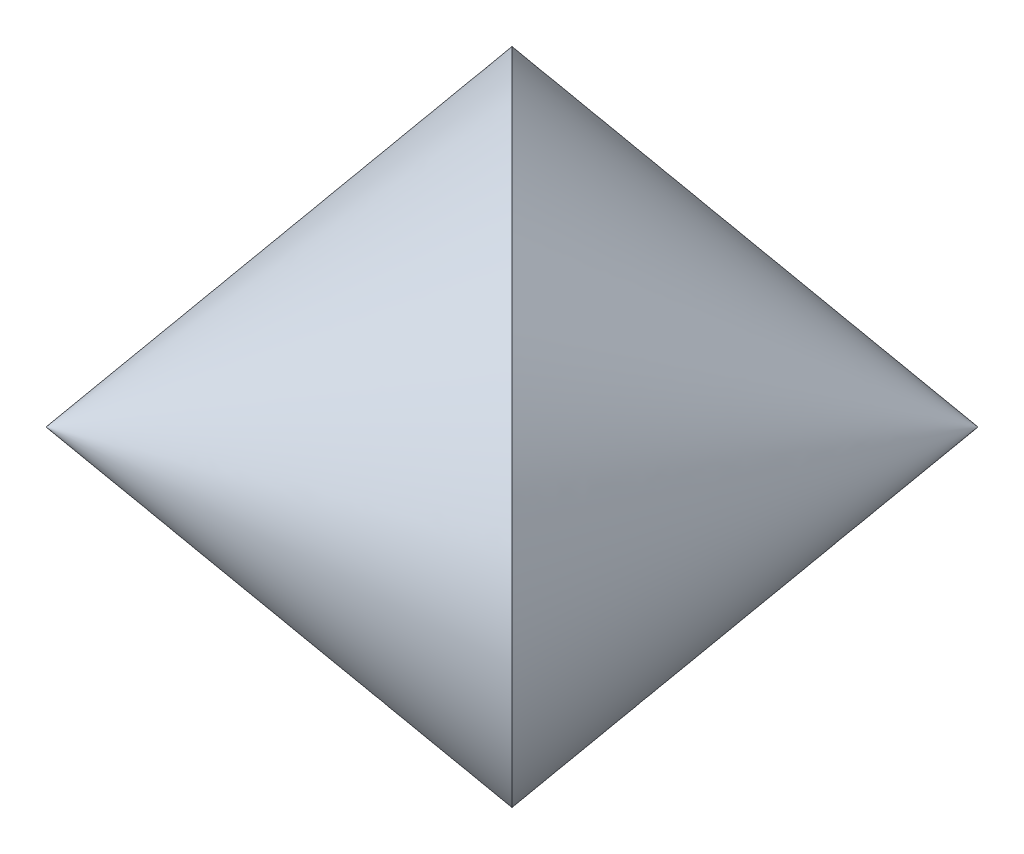
ISO-10303-21;
HEADER;
FILE_DESCRIPTION(('STEP AP214'),'2;1');
FILE_NAME('part.step','',(''),(''),'','','');
FILE_SCHEMA(('AUTOMOTIVE_DESIGN { 1 0 10303 214 1 1 1 1 }'));
ENDSEC;
DATA;
#1=APPLICATION_CONTEXT('core data for automotive mechanical design processes');
#2=APPLICATION_PROTOCOL_DEFINITION('international standard','automotive_design',2000,#1);
#3=PRODUCT_CONTEXT('',#1,'mechanical');
#4=PRODUCT('Part','Part','',(#3));
#5=PRODUCT_RELATED_PRODUCT_CATEGORY('part','',(#4));
#6=PRODUCT_DEFINITION_FORMATION('','',#4);
#7=PRODUCT_DEFINITION_CONTEXT('part definition',#1,'design');
#8=PRODUCT_DEFINITION('design','',#6,#7);
#9=PRODUCT_DEFINITION_SHAPE('','',#8);
#10=(LENGTH_UNIT() NAMED_UNIT(*) SI_UNIT(.MILLI.,.METRE.));
#11=(NAMED_UNIT(*) PLANE_ANGLE_UNIT() SI_UNIT($,.RADIAN.));
#12=(NAMED_UNIT(*) SI_UNIT($,.STERADIAN.) SOLID_ANGLE_UNIT());
#13=UNCERTAINTY_MEASURE_WITH_UNIT(LENGTH_MEASURE(1.E-05),#10,'distance_accuracy_value','');
#14=(GEOMETRIC_REPRESENTATION_CONTEXT(3) GLOBAL_UNCERTAINTY_ASSIGNED_CONTEXT((#13)) GLOBAL_UNIT_ASSIGNED_CONTEXT((#10,
#11,#12)) REPRESENTATION_CONTEXT('',''));
#15=CARTESIAN_POINT('',(0.,0.,0.));
#16=DIRECTION('',(0.,0.,1.));
#17=DIRECTION('',(1.,0.,0.));
#18=AXIS2_PLACEMENT_3D('',#15,#16,#17);
#19=CARTESIAN_POINT('',(-15.,0.,-15.));
#20=CARTESIAN_POINT('',(15.,0.,-15.));
#21=CARTESIAN_POINT('',(-15.,-0.490468476861543,-15.));
#22=CARTESIAN_POINT('',(15.,0.,-15.));
#23=CARTESIAN_POINT('',(-14.9763536758897,-1.01829653407584,-14.9763536758898));
#24=CARTESIAN_POINT('',(15.,0.,-15.));
#25=CARTESIAN_POINT('',(-14.8550827815939,-2.15745516955501,-14.8550827815939));
#26=CARTESIAN_POINT('',(15.,0.,-15.));
#27=CARTESIAN_POINT('',(-14.7575610644823,-2.76896889275875,-14.7575610644823));
#28=CARTESIAN_POINT('',(15.,0.,-15.));
#29=CARTESIAN_POINT('',(-14.4503494354816,-4.0792399406588,-14.4503494354816));
#30=CARTESIAN_POINT('',(15.,0.,-15.));
#31=CARTESIAN_POINT('',(-14.2407053111242,-4.7783341356784,-14.2407053111242));
#32=CARTESIAN_POINT('',(15.,0.,-15.));
#33=CARTESIAN_POINT('',(-13.6568142967612,-6.25472526448997,-13.6568142967612));
#34=CARTESIAN_POINT('',(15.,0.,-15.));
#35=CARTESIAN_POINT('',(-13.2823986132404,-7.03255240499426,-13.2823986132404));
#36=CARTESIAN_POINT('',(15.,0.,-15.));
#37=CARTESIAN_POINT('',(-12.3033850950057,-8.63166388675964,-12.3033850950057));
#38=CARTESIAN_POINT('',(15.,0.,-15.));
#39=CARTESIAN_POINT('',(-11.6981138680891,-9.45356289760725,-11.6981138680891));
#40=CARTESIAN_POINT('',(15.,0.,-15.));
#41=CARTESIAN_POINT('',(-10.1900521146747,-11.0624842341134,-10.1900521146747));
#42=CARTESIAN_POINT('',(15.,0.,-15.));
#43=CARTESIAN_POINT('',(-9.28580167646367,-11.8496901998731,-9.28580167646368));
#44=CARTESIAN_POINT('',(15.,0.,-15.));
#45=CARTESIAN_POINT('',(-7.67783908842913,-12.9019806457802,-7.67783908842914));
#46=CARTESIAN_POINT('',(15.,0.,-15.));
#47=CARTESIAN_POINT('',(-7.1003004036042,-13.230836191688,-7.1003004036042));
#48=CARTESIAN_POINT('',(15.,0.,-15.));
#49=CARTESIAN_POINT('',(-5.86475578991012,-13.8229494565169,-5.86475578991013));
#50=CARTESIAN_POINT('',(15.,0.,-15.));
#51=CARTESIAN_POINT('',(-5.2066991321325,-14.0861344778039,-5.2066991321325));
#52=CARTESIAN_POINT('',(15.,0.,-15.));
#53=CARTESIAN_POINT('',(-3.81958572984646,-14.5237620894752,-3.81958572984646));
#54=CARTESIAN_POINT('',(15.,0.,-15.));
#55=CARTESIAN_POINT('',(-3.09050939817725,-14.6981006218509,-3.09050939817725));
#56=CARTESIAN_POINT('',(15.,0.,-15.));
#57=CARTESIAN_POINT('',(-1.57891687390269,-14.9362790458528,-1.57891687390269));
#58=CARTESIAN_POINT('',(15.,0.,-15.));
#59=CARTESIAN_POINT('',(-0.796432428235895,-15.,-0.796432428235897));
#60=CARTESIAN_POINT('',(15.,0.,-15.));
#61=CARTESIAN_POINT('',(0.796432428235894,-15.,0.796432428235891));
#62=CARTESIAN_POINT('',(15.,0.,-15.));
#63=CARTESIAN_POINT('',(1.57891687390269,-14.9362790458528,1.57891687390269));
#64=CARTESIAN_POINT('',(15.,0.,-15.));
#65=CARTESIAN_POINT('',(3.09050939817725,-14.6981006218509,3.09050939817725));
#66=CARTESIAN_POINT('',(15.,0.,-15.));
#67=CARTESIAN_POINT('',(3.81958572984646,-14.5237620894752,3.81958572984645));
#68=CARTESIAN_POINT('',(15.,0.,-15.));
#69=CARTESIAN_POINT('',(5.2066991321325,-14.0861344778039,5.2066991321325));
#70=CARTESIAN_POINT('',(15.,0.,-15.));
#71=CARTESIAN_POINT('',(5.86475578991012,-13.8229494565169,5.86475578991012));
#72=CARTESIAN_POINT('',(15.,0.,-15.));
#73=CARTESIAN_POINT('',(7.10030040360419,-13.230836191688,7.10030040360419));
#74=CARTESIAN_POINT('',(15.,0.,-15.));
#75=CARTESIAN_POINT('',(7.67783908842914,-12.9019806457802,7.67783908842914));
#76=CARTESIAN_POINT('',(15.,0.,-15.));
#77=CARTESIAN_POINT('',(9.28580167646367,-11.8496901998731,9.28580167646367));
#78=CARTESIAN_POINT('',(15.,0.,-15.));
#79=CARTESIAN_POINT('',(10.1900521146747,-11.0624842341134,10.1900521146747));
#80=CARTESIAN_POINT('',(15.,0.,-15.));
#81=CARTESIAN_POINT('',(11.6981138680891,-9.45356289760725,11.6981138680891));
#82=CARTESIAN_POINT('',(15.,0.,-15.));
#83=CARTESIAN_POINT('',(12.3033850950057,-8.63166388675965,12.3033850950057));
#84=CARTESIAN_POINT('',(15.,0.,-15.));
#85=CARTESIAN_POINT('',(13.2823986132404,-7.03255240499427,13.2823986132404));
#86=CARTESIAN_POINT('',(15.,0.,-15.));
#87=CARTESIAN_POINT('',(13.6568142967612,-6.25472526448998,13.6568142967613));
#88=CARTESIAN_POINT('',(15.,0.,-15.));
#89=CARTESIAN_POINT('',(14.2407053111243,-4.77833413567841,14.2407053111243));
#90=CARTESIAN_POINT('',(15.,0.,-15.));
#91=CARTESIAN_POINT('',(14.4503494354816,-4.07923994065881,14.4503494354816));
#92=CARTESIAN_POINT('',(15.,0.,-15.));
#93=CARTESIAN_POINT('',(14.7575610644823,-2.76896889275876,14.7575610644823));
#94=CARTESIAN_POINT('',(15.,0.,-15.));
#95=CARTESIAN_POINT('',(14.8550827815939,-2.15745516955502,14.8550827815939));
#96=CARTESIAN_POINT('',(15.,0.,-15.));
#97=CARTESIAN_POINT('',(14.9763536758897,-1.01829653407585,14.9763536758898));
#98=CARTESIAN_POINT('',(15.,0.,-15.));
#99=CARTESIAN_POINT('',(15.,-0.490468476861552,15.));
#100=CARTESIAN_POINT('',(15.,0.,-15.));
#101=CARTESIAN_POINT('',(15.,0.490468476861535,15.));
#102=CARTESIAN_POINT('',(15.,0.,-15.));
#103=CARTESIAN_POINT('',(14.9763536758898,1.01829653407583,14.9763536758898));
#104=CARTESIAN_POINT('',(15.,0.,-15.));
#105=CARTESIAN_POINT('',(14.8550827815939,2.15745516955501,14.8550827815939));
#106=CARTESIAN_POINT('',(15.,0.,-15.));
#107=CARTESIAN_POINT('',(14.7575610644823,2.76896889275874,14.7575610644823));
#108=CARTESIAN_POINT('',(15.,0.,-15.));
#109=CARTESIAN_POINT('',(14.4503494354816,4.07923994065879,14.4503494354816));
#110=CARTESIAN_POINT('',(15.,0.,-15.));
#111=CARTESIAN_POINT('',(14.2407053111242,4.77833413567839,14.2407053111243));
#112=CARTESIAN_POINT('',(15.,0.,-15.));
#113=CARTESIAN_POINT('',(13.6568142967612,6.25472526448997,13.6568142967613));
#114=CARTESIAN_POINT('',(15.,0.,-15.));
#115=CARTESIAN_POINT('',(13.2823986132404,7.03255240499425,13.2823986132404));
#116=CARTESIAN_POINT('',(15.,0.,-15.));
#117=CARTESIAN_POINT('',(12.3033850950057,8.63166388675963,12.3033850950057));
#118=CARTESIAN_POINT('',(15.,0.,-15.));
#119=CARTESIAN_POINT('',(11.6981138680891,9.45356289760724,11.6981138680891));
#120=CARTESIAN_POINT('',(15.,0.,-15.));
#121=CARTESIAN_POINT('',(10.1900521146747,11.0624842341134,10.1900521146747));
#122=CARTESIAN_POINT('',(15.,0.,-15.));
#123=CARTESIAN_POINT('',(9.28580167646367,11.8496901998731,9.28580167646368));
#124=CARTESIAN_POINT('',(15.,0.,-15.));
#125=CARTESIAN_POINT('',(7.67783908842913,12.9019806457801,7.67783908842914));
#126=CARTESIAN_POINT('',(15.,0.,-15.));
#127=CARTESIAN_POINT('',(7.10030040360419,13.230836191688,7.1003004036042));
#128=CARTESIAN_POINT('',(15.,0.,-15.));
#129=CARTESIAN_POINT('',(5.86475578991012,13.8229494565168,5.86475578991013));
#130=CARTESIAN_POINT('',(15.,0.,-15.));
#131=CARTESIAN_POINT('',(5.2066991321325,14.0861344778039,5.2066991321325));
#132=CARTESIAN_POINT('',(15.,0.,-15.));
#133=CARTESIAN_POINT('',(3.81958572984646,14.5237620894752,3.81958572984646));
#134=CARTESIAN_POINT('',(15.,0.,-15.));
#135=CARTESIAN_POINT('',(3.09050939817725,14.6981006218509,3.09050939817726));
#136=CARTESIAN_POINT('',(15.,0.,-15.));
#137=CARTESIAN_POINT('',(1.57891687390269,14.9362790458528,1.57891687390269));
#138=CARTESIAN_POINT('',(15.,0.,-15.));
#139=CARTESIAN_POINT('',(0.796432428235893,15.,0.7964324282359));
#140=CARTESIAN_POINT('',(15.,0.,-15.));
#141=CARTESIAN_POINT('',(-0.796432428235895,15.,-0.796432428235889));
#142=CARTESIAN_POINT('',(15.,0.,-15.));
#143=CARTESIAN_POINT('',(-1.57891687390269,14.9362790458528,-1.57891687390268));
#144=CARTESIAN_POINT('',(15.,0.,-15.));
#145=CARTESIAN_POINT('',(-3.09050939817725,14.6981006218509,-3.09050939817725));
#146=CARTESIAN_POINT('',(15.,0.,-15.));
#147=CARTESIAN_POINT('',(-3.81958572984646,14.5237620894752,-3.81958572984645));
#148=CARTESIAN_POINT('',(15.,0.,-15.));
#149=CARTESIAN_POINT('',(-5.2066991321325,14.0861344778039,-5.20669913213249));
#150=CARTESIAN_POINT('',(15.,0.,-15.));
#151=CARTESIAN_POINT('',(-5.86475578991013,13.8229494565168,-5.86475578991012));
#152=CARTESIAN_POINT('',(15.,0.,-15.));
#153=CARTESIAN_POINT('',(-7.10030040360419,13.230836191688,-7.10030040360419));
#154=CARTESIAN_POINT('',(15.,0.,-15.));
#155=CARTESIAN_POINT('',(-7.67783908842912,12.9019806457802,-7.67783908842912));
#156=CARTESIAN_POINT('',(15.,0.,-15.));
#157=CARTESIAN_POINT('',(-9.28580167646367,11.8496901998731,-9.28580167646366));
#158=CARTESIAN_POINT('',(15.,0.,-15.));
#159=CARTESIAN_POINT('',(-10.1900521146747,11.0624842341134,-10.1900521146747));
#160=CARTESIAN_POINT('',(15.,0.,-15.));
#161=CARTESIAN_POINT('',(-11.6981138680891,9.45356289760725,-11.6981138680891));
#162=CARTESIAN_POINT('',(15.,0.,-15.));
#163=CARTESIAN_POINT('',(-12.3033850950057,8.63166388675965,-12.3033850950057));
#164=CARTESIAN_POINT('',(15.,0.,-15.));
#165=CARTESIAN_POINT('',(-13.2823986132404,7.03255240499425,-13.2823986132404));
#166=CARTESIAN_POINT('',(15.,0.,-15.));
#167=CARTESIAN_POINT('',(-13.6568142967612,6.25472526448999,-13.6568142967612));
#168=CARTESIAN_POINT('',(15.,0.,-15.));
#169=CARTESIAN_POINT('',(-14.2407053111242,4.7783341356784,-14.2407053111242));
#170=CARTESIAN_POINT('',(15.,0.,-15.));
#171=CARTESIAN_POINT('',(-14.4503494354816,4.07923994065881,-14.4503494354816));
#172=CARTESIAN_POINT('',(15.,0.,-15.));
#173=CARTESIAN_POINT('',(-14.7575610644823,2.76896889275875,-14.7575610644823));
#174=CARTESIAN_POINT('',(15.,0.,-15.));
#175=CARTESIAN_POINT('',(-14.8550827815939,2.15745516955502,-14.8550827815939));
#176=CARTESIAN_POINT('',(15.,0.,-15.));
#177=CARTESIAN_POINT('',(-14.9763536758897,1.01829653407584,-14.9763536758898));
#178=CARTESIAN_POINT('',(15.,0.,-15.));
#179=CARTESIAN_POINT('',(-15.,0.490468476861543,-15.));
#180=CARTESIAN_POINT('',(15.,0.,-15.));
#181=CARTESIAN_POINT('',(-15.,0.,-15.));
#182=CARTESIAN_POINT('',(15.,0.,-15.));
#183=B_SPLINE_SURFACE_WITH_KNOTS('',3,1,((#19,#20),(#21,#22),(#23,#24),(#25,#26),(#27,#28),(#29,
#30),(#31,#32),(#33,#34),(#35,#36),(#37,#38),(#39,#40),(#41,#42),(#43,#44),(#45,#46),(#47,#48),
(#49,#50),(#51,#52),(#53,#54),(#55,#56),(#57,#58),(#59,#60),(#61,#62),(#63,#64),(#65,#66),(#67,
#68),(#69,#70),(#71,#72),(#73,#74),(#75,#76),(#77,#78),(#79,#80),(#81,#82),(#83,#84),(#85,#86),
(#87,#88),(#89,#90),(#91,#92),(#93,#94),(#95,#96),(#97,#98),(#99,#100),(#101,#102),(#103,#104),
(#105,#106),(#107,#108),(#109,#110),(#111,#112),(#113,#114),(#115,#116),(#117,#118),(#119,#120),
(#121,#122),(#123,#124),(#125,#126),(#127,#128),(#129,#130),(#131,#132),(#133,#134),(#135,#136),
(#137,#138),(#139,#140),(#141,#142),(#143,#144),(#145,#146),(#147,#148),(#149,#150),(#151,#152),
(#153,#154),(#155,#156),(#157,#158),(#159,#160),(#161,#162),(#163,#164),(#165,#166),(#167,#168),
(#169,#170),(#171,#172),(#173,#174),(#175,#176),(#177,#178),(#179,#180),(#181,#182)),
.UNSPECIFIED.,.T.,.F.,.F.,(4,2,2,2,2,2,2,2,2,2,2,2,2,2,2,2,2,2,2,2,2,2,2,2,2,2,2,2,2,2,2,2,2,2,
2,2,2,2,2,2,4),(2,2),(0.,0.03125,0.0625,0.09375,0.125,0.15625,0.1875,0.203125,0.21875,0.234375,
0.25,0.265625,0.28125,0.296875,0.3125,0.34375,0.375,0.40625,0.4375,0.46875,0.5,0.53125,0.5625,
0.59375,0.625,0.65625,0.6875,0.703125,0.71875,0.734375,0.75,0.765625,0.78125,0.796875,0.8125,
0.84375,0.875,0.90625,0.9375,0.96875,1.),(0.,1.),.UNSPECIFIED.);
#184=CARTESIAN_POINT('',(0.,0.,0.));
#185=DIRECTION('',(0.707106781186548,0.,-0.707106781186547));
#186=DIRECTION('',(-0.707106781186547,0.,-0.707106781186548));
#187=AXIS2_PLACEMENT_3D('',#184,#185,#186);
#188=ELLIPSE('',#187,21.2132034355964,15.);
#189=CARTESIAN_POINT('',(-15.,0.,-15.));
#190=VERTEX_POINT('',#189);
#191=EDGE_CURVE('E12',#190,#190,#188,.T.);
#192=CARTESIAN_POINT('',(15.,0.,-15.));
#193=VERTEX_POINT('',#192);
#194=VERTEX_LOOP('',#193);
#195=FACE_BOUND('',#194,.T.);
#196=ORIENTED_EDGE('',*,*,#191,.T.);
#197=EDGE_LOOP('',(#196));
#198=FACE_BOUND('',#197,.T.);
#199=ADVANCED_FACE('F61',(#195,#198),#183,.F.);
#200=CARTESIAN_POINT('',(-15.,0.,-15.));
#201=CARTESIAN_POINT('',(-15.,0.,15.));
#202=CARTESIAN_POINT('',(-15.,-0.490468476861543,-15.));
#203=CARTESIAN_POINT('',(-15.,0.,15.));
#204=CARTESIAN_POINT('',(-14.9763536758898,-1.01829653407584,-14.9763536758898));
#205=CARTESIAN_POINT('',(-15.,0.,15.));
#206=CARTESIAN_POINT('',(-14.8550827815939,-2.15745516955501,-14.8550827815939));
#207=CARTESIAN_POINT('',(-15.,0.,15.));
#208=CARTESIAN_POINT('',(-14.7575610644823,-2.76896889275875,-14.7575610644823));
#209=CARTESIAN_POINT('',(-15.,0.,15.));
#210=CARTESIAN_POINT('',(-14.4503494354816,-4.0792399406588,-14.4503494354816));
#211=CARTESIAN_POINT('',(-15.,0.,15.));
#212=CARTESIAN_POINT('',(-14.2407053111242,-4.7783341356784,-14.2407053111242));
#213=CARTESIAN_POINT('',(-15.,0.,15.));
#214=CARTESIAN_POINT('',(-13.6568142967612,-6.25472526448997,-13.6568142967613));
#215=CARTESIAN_POINT('',(-15.,0.,15.));
#216=CARTESIAN_POINT('',(-13.2823986132404,-7.03255240499426,-13.2823986132404));
#217=CARTESIAN_POINT('',(-15.,0.,15.));
#218=CARTESIAN_POINT('',(-12.3033850950057,-8.63166388675964,-12.3033850950057));
#219=CARTESIAN_POINT('',(-15.,0.,15.));
#220=CARTESIAN_POINT('',(-11.6981138680891,-9.45356289760725,-11.6981138680891));
#221=CARTESIAN_POINT('',(-15.,0.,15.));
#222=CARTESIAN_POINT('',(-10.1900521146747,-11.0624842341134,-10.1900521146747));
#223=CARTESIAN_POINT('',(-15.,0.,15.));
#224=CARTESIAN_POINT('',(-9.28580167646367,-11.8496901998731,-9.28580167646368));
#225=CARTESIAN_POINT('',(-15.,0.,15.));
#226=CARTESIAN_POINT('',(-7.67783908842913,-12.9019806457802,-7.67783908842914));
#227=CARTESIAN_POINT('',(-15.,0.,15.));
#228=CARTESIAN_POINT('',(-7.10030040360419,-13.230836191688,-7.1003004036042));
#229=CARTESIAN_POINT('',(-15.,0.,15.));
#230=CARTESIAN_POINT('',(-5.86475578991012,-13.8229494565169,-5.86475578991013));
#231=CARTESIAN_POINT('',(-15.,0.,15.));
#232=CARTESIAN_POINT('',(-5.2066991321325,-14.0861344778039,-5.2066991321325));
#233=CARTESIAN_POINT('',(-15.,0.,15.));
#234=CARTESIAN_POINT('',(-3.81958572984646,-14.5237620894752,-3.81958572984646));
#235=CARTESIAN_POINT('',(-15.,0.,15.));
#236=CARTESIAN_POINT('',(-3.09050939817725,-14.6981006218509,-3.09050939817726));
#237=CARTESIAN_POINT('',(-15.,0.,15.));
#238=CARTESIAN_POINT('',(-1.57891687390268,-14.9362790458528,-1.57891687390269));
#239=CARTESIAN_POINT('',(-15.,0.,15.));
#240=CARTESIAN_POINT('',(-0.796432428235891,-15.,-0.7964324282359));
#241=CARTESIAN_POINT('',(-15.,0.,15.));
#242=CARTESIAN_POINT('',(0.796432428235896,-15.,0.79643242823589));
#243=CARTESIAN_POINT('',(-15.,0.,15.));
#244=CARTESIAN_POINT('',(1.57891687390269,-14.9362790458528,1.57891687390268));
#245=CARTESIAN_POINT('',(-15.,0.,15.));
#246=CARTESIAN_POINT('',(3.09050939817725,-14.6981006218509,3.09050939817724));
#247=CARTESIAN_POINT('',(-15.,0.,15.));
#248=CARTESIAN_POINT('',(3.81958572984646,-14.5237620894752,3.81958572984645));
#249=CARTESIAN_POINT('',(-15.,0.,15.));
#250=CARTESIAN_POINT('',(5.2066991321325,-14.0861344778039,5.20669913213249));
#251=CARTESIAN_POINT('',(-15.,0.,15.));
#252=CARTESIAN_POINT('',(5.86475578991013,-13.8229494565169,5.86475578991012));
#253=CARTESIAN_POINT('',(-15.,0.,15.));
#254=CARTESIAN_POINT('',(7.10030040360419,-13.230836191688,7.10030040360419));
#255=CARTESIAN_POINT('',(-15.,0.,15.));
#256=CARTESIAN_POINT('',(7.67783908842914,-12.9019806457802,7.67783908842913));
#257=CARTESIAN_POINT('',(-15.,0.,15.));
#258=CARTESIAN_POINT('',(9.28580167646367,-11.8496901998731,9.28580167646366));
#259=CARTESIAN_POINT('',(-15.,0.,15.));
#260=CARTESIAN_POINT('',(10.1900521146747,-11.0624842341134,10.1900521146747));
#261=CARTESIAN_POINT('',(-15.,0.,15.));
#262=CARTESIAN_POINT('',(11.6981138680891,-9.45356289760725,11.6981138680891));
#263=CARTESIAN_POINT('',(-15.,0.,15.));
#264=CARTESIAN_POINT('',(12.3033850950057,-8.63166388675965,12.3033850950057));
#265=CARTESIAN_POINT('',(-15.,0.,15.));
#266=CARTESIAN_POINT('',(13.2823986132404,-7.03255240499427,13.2823986132404));
#267=CARTESIAN_POINT('',(-15.,0.,15.));
#268=CARTESIAN_POINT('',(13.6568142967613,-6.25472526448998,13.6568142967613));
#269=CARTESIAN_POINT('',(-15.,0.,15.));
#270=CARTESIAN_POINT('',(14.2407053111242,-4.77833413567841,14.2407053111243));
#271=CARTESIAN_POINT('',(-15.,0.,15.));
#272=CARTESIAN_POINT('',(14.4503494354816,-4.07923994065881,14.4503494354816));
#273=CARTESIAN_POINT('',(-15.,0.,15.));
#274=CARTESIAN_POINT('',(14.7575610644823,-2.76896889275876,14.7575610644823));
#275=CARTESIAN_POINT('',(-15.,0.,15.));
#276=CARTESIAN_POINT('',(14.8550827815939,-2.15745516955502,14.8550827815939));
#277=CARTESIAN_POINT('',(-15.,0.,15.));
#278=CARTESIAN_POINT('',(14.9763536758898,-1.01829653407585,14.9763536758898));
#279=CARTESIAN_POINT('',(-15.,0.,15.));
#280=CARTESIAN_POINT('',(15.,-0.490468476861552,15.));
#281=CARTESIAN_POINT('',(-15.,0.,15.));
#282=CARTESIAN_POINT('',(15.,0.490468476861535,15.));
#283=CARTESIAN_POINT('',(-15.,0.,15.));
#284=CARTESIAN_POINT('',(14.9763536758898,1.01829653407583,14.9763536758898));
#285=CARTESIAN_POINT('',(-15.,0.,15.));
#286=CARTESIAN_POINT('',(14.8550827815939,2.15745516955501,14.8550827815939));
#287=CARTESIAN_POINT('',(-15.,0.,15.));
#288=CARTESIAN_POINT('',(14.7575610644823,2.76896889275874,14.7575610644823));
#289=CARTESIAN_POINT('',(-15.,0.,15.));
#290=CARTESIAN_POINT('',(14.4503494354816,4.07923994065879,14.4503494354816));
#291=CARTESIAN_POINT('',(-15.,0.,15.));
#292=CARTESIAN_POINT('',(14.2407053111242,4.77833413567839,14.2407053111242));
#293=CARTESIAN_POINT('',(-15.,0.,15.));
#294=CARTESIAN_POINT('',(13.6568142967613,6.25472526448997,13.6568142967613));
#295=CARTESIAN_POINT('',(-15.,0.,15.));
#296=CARTESIAN_POINT('',(13.2823986132404,7.03255240499425,13.2823986132404));
#297=CARTESIAN_POINT('',(-15.,0.,15.));
#298=CARTESIAN_POINT('',(12.3033850950057,8.63166388675963,12.3033850950057));
#299=CARTESIAN_POINT('',(-15.,0.,15.));
#300=CARTESIAN_POINT('',(11.6981138680891,9.45356289760724,11.6981138680891));
#301=CARTESIAN_POINT('',(-15.,0.,15.));
#302=CARTESIAN_POINT('',(10.1900521146747,11.0624842341134,10.1900521146747));
#303=CARTESIAN_POINT('',(-15.,0.,15.));
#304=CARTESIAN_POINT('',(9.28580167646367,11.8496901998731,9.28580167646368));
#305=CARTESIAN_POINT('',(-15.,0.,15.));
#306=CARTESIAN_POINT('',(7.67783908842913,12.9019806457801,7.67783908842914));
#307=CARTESIAN_POINT('',(-15.,0.,15.));
#308=CARTESIAN_POINT('',(7.1003004036042,13.230836191688,7.1003004036042));
#309=CARTESIAN_POINT('',(-15.,0.,15.));
#310=CARTESIAN_POINT('',(5.86475578991012,13.8229494565168,5.86475578991013));
#311=CARTESIAN_POINT('',(-15.,0.,15.));
#312=CARTESIAN_POINT('',(5.2066991321325,14.0861344778039,5.2066991321325));
#313=CARTESIAN_POINT('',(-15.,0.,15.));
#314=CARTESIAN_POINT('',(3.81958572984646,14.5237620894752,3.81958572984646));
#315=CARTESIAN_POINT('',(-15.,0.,15.));
#316=CARTESIAN_POINT('',(3.09050939817725,14.6981006218509,3.09050939817725));
#317=CARTESIAN_POINT('',(-15.,0.,15.));
#318=CARTESIAN_POINT('',(1.57891687390269,14.9362790458528,1.57891687390269));
#319=CARTESIAN_POINT('',(-15.,0.,15.));
#320=CARTESIAN_POINT('',(0.796432428235894,15.,0.796432428235898));
#321=CARTESIAN_POINT('',(-15.,0.,15.));
#322=CARTESIAN_POINT('',(-0.796432428235894,15.,-0.79643242823589));
#323=CARTESIAN_POINT('',(-15.,0.,15.));
#324=CARTESIAN_POINT('',(-1.57891687390269,14.9362790458528,-1.57891687390268));
#325=CARTESIAN_POINT('',(-15.,0.,15.));
#326=CARTESIAN_POINT('',(-3.09050939817725,14.6981006218509,-3.09050939817725));
#327=CARTESIAN_POINT('',(-15.,0.,15.));
#328=CARTESIAN_POINT('',(-3.81958572984646,14.5237620894752,-3.81958572984645));
#329=CARTESIAN_POINT('',(-15.,0.,15.));
#330=CARTESIAN_POINT('',(-5.2066991321325,14.0861344778039,-5.20669913213249));
#331=CARTESIAN_POINT('',(-15.,0.,15.));
#332=CARTESIAN_POINT('',(-5.86475578991013,13.8229494565168,-5.86475578991012));
#333=CARTESIAN_POINT('',(-15.,0.,15.));
#334=CARTESIAN_POINT('',(-7.10030040360419,13.230836191688,-7.10030040360419));
#335=CARTESIAN_POINT('',(-15.,0.,15.));
#336=CARTESIAN_POINT('',(-7.67783908842912,12.9019806457802,-7.67783908842912));
#337=CARTESIAN_POINT('',(-15.,0.,15.));
#338=CARTESIAN_POINT('',(-9.28580167646366,11.8496901998731,-9.28580167646366));
#339=CARTESIAN_POINT('',(-15.,0.,15.));
#340=CARTESIAN_POINT('',(-10.1900521146747,11.0624842341134,-10.1900521146747));
#341=CARTESIAN_POINT('',(-15.,0.,15.));
#342=CARTESIAN_POINT('',(-11.6981138680891,9.45356289760725,-11.6981138680891));
#343=CARTESIAN_POINT('',(-15.,0.,15.));
#344=CARTESIAN_POINT('',(-12.3033850950057,8.63166388675965,-12.3033850950057));
#345=CARTESIAN_POINT('',(-15.,0.,15.));
#346=CARTESIAN_POINT('',(-13.2823986132404,7.03255240499425,-13.2823986132404));
#347=CARTESIAN_POINT('',(-15.,0.,15.));
#348=CARTESIAN_POINT('',(-13.6568142967612,6.25472526448999,-13.6568142967613));
#349=CARTESIAN_POINT('',(-15.,0.,15.));
#350=CARTESIAN_POINT('',(-14.2407053111242,4.7783341356784,-14.2407053111242));
#351=CARTESIAN_POINT('',(-15.,0.,15.));
#352=CARTESIAN_POINT('',(-14.4503494354816,4.07923994065881,-14.4503494354816));
#353=CARTESIAN_POINT('',(-15.,0.,15.));
#354=CARTESIAN_POINT('',(-14.7575610644823,2.76896889275875,-14.7575610644823));
#355=CARTESIAN_POINT('',(-15.,0.,15.));
#356=CARTESIAN_POINT('',(-14.8550827815939,2.15745516955502,-14.8550827815939));
#357=CARTESIAN_POINT('',(-15.,0.,15.));
#358=CARTESIAN_POINT('',(-14.9763536758898,1.01829653407584,-14.9763536758898));
#359=CARTESIAN_POINT('',(-15.,0.,15.));
#360=CARTESIAN_POINT('',(-15.,0.490468476861543,-15.));
#361=CARTESIAN_POINT('',(-15.,0.,15.));
#362=CARTESIAN_POINT('',(-15.,0.,-15.));
#363=CARTESIAN_POINT('',(-15.,0.,15.));
#364=B_SPLINE_SURFACE_WITH_KNOTS('',3,1,((#200,#201),(#202,#203),(#204,#205),(#206,#207),(#208,
#209),(#210,#211),(#212,#213),(#214,#215),(#216,#217),(#218,#219),(#220,#221),(#222,#223),(#224,
#225),(#226,#227),(#228,#229),(#230,#231),(#232,#233),(#234,#235),(#236,#237),(#238,#239),(#240,
#241),(#242,#243),(#244,#245),(#246,#247),(#248,#249),(#250,#251),(#252,#253),(#254,#255),(#256,
#257),(#258,#259),(#260,#261),(#262,#263),(#264,#265),(#266,#267),(#268,#269),(#270,#271),(#272,
#273),(#274,#275),(#276,#277),(#278,#279),(#280,#281),(#282,#283),(#284,#285),(#286,#287),(#288,
#289),(#290,#291),(#292,#293),(#294,#295),(#296,#297),(#298,#299),(#300,#301),(#302,#303),(#304,
#305),(#306,#307),(#308,#309),(#310,#311),(#312,#313),(#314,#315),(#316,#317),(#318,#319),(#320,
#321),(#322,#323),(#324,#325),(#326,#327),(#328,#329),(#330,#331),(#332,#333),(#334,#335),(#336,
#337),(#338,#339),(#340,#341),(#342,#343),(#344,#345),(#346,#347),(#348,#349),(#350,#351),(#352,
#353),(#354,#355),(#356,#357),(#358,#359),(#360,#361),(#362,#363)),.UNSPECIFIED.,.T.,.F.,.F.,(4,
2,2,2,2,2,2,2,2,2,2,2,2,2,2,2,2,2,2,2,2,2,2,2,2,2,2,2,2,2,2,2,2,2,2,2,2,2,2,2,4),(2,2),(0.,
0.03125,0.0625,0.09375,0.125,0.15625,0.1875,0.203125,0.21875,0.234375,0.25,0.265625,0.28125,
0.296875,0.3125,0.34375,0.375,0.40625,0.4375,0.46875,0.5,0.53125,0.5625,0.59375,0.625,0.65625,
0.6875,0.703125,0.71875,0.734375,0.75,0.765625,0.78125,0.796875,0.8125,0.84375,0.875,0.90625,
0.9375,0.96875,1.),(0.,1.),.UNSPECIFIED.);
#365=CARTESIAN_POINT('',(-15.,0.,15.));
#366=VERTEX_POINT('',#365);
#367=VERTEX_LOOP('',#366);
#368=FACE_BOUND('',#367,.T.);
#369=ORIENTED_EDGE('',*,*,#191,.F.);
#370=EDGE_LOOP('',(#369));
#371=FACE_BOUND('',#370,.T.);
#372=ADVANCED_FACE('F63',(#368,#371),#364,.T.);
#373=CLOSED_SHELL('',(#199,#372));
#374=MANIFOLD_SOLID_BREP('B2',#373);
#375=ADVANCED_BREP_SHAPE_REPRESENTATION('',(#18,#374),#14);
#376=SHAPE_DEFINITION_REPRESENTATION(#9,#375);
ENDSEC;
END-ISO-10303-21;
